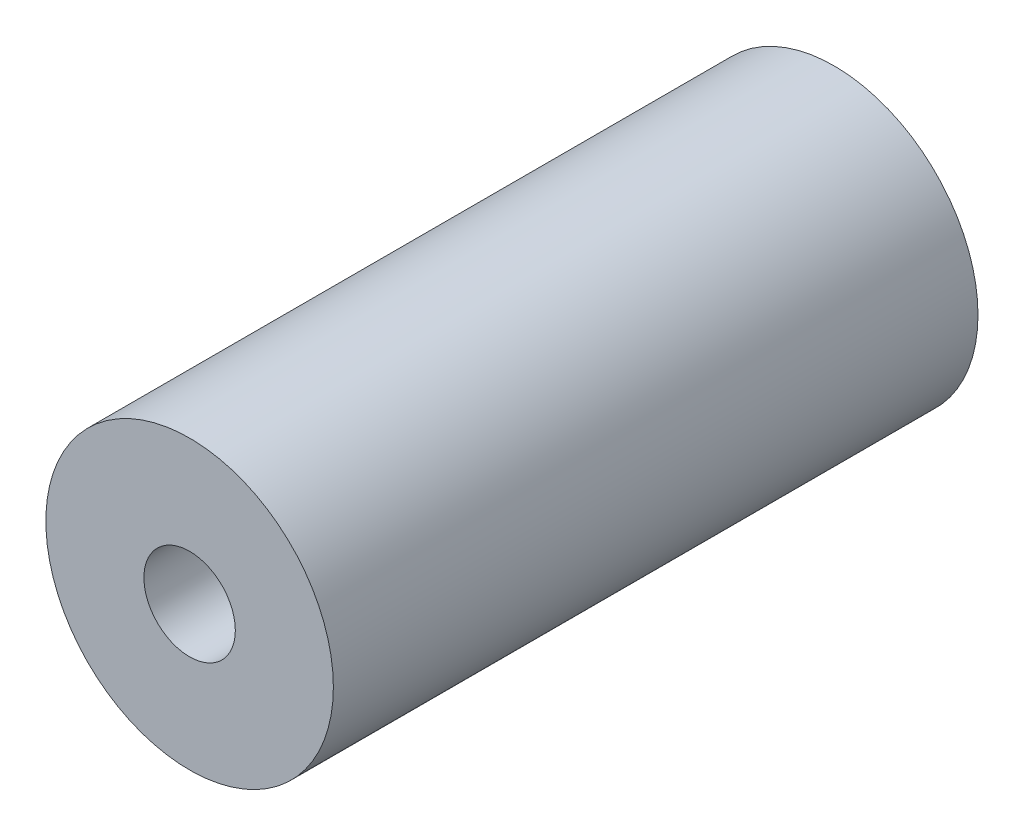
ISO-10303-21;
HEADER;
FILE_DESCRIPTION(('STEP AP214'),'2;1');
FILE_NAME('part.step','',(''),(''),'','','');
FILE_SCHEMA(('AUTOMOTIVE_DESIGN { 1 0 10303 214 1 1 1 1 }'));
ENDSEC;
DATA;
#1=APPLICATION_CONTEXT('core data for automotive mechanical design processes');
#2=APPLICATION_PROTOCOL_DEFINITION('international standard','automotive_design',2000,#1);
#3=PRODUCT_CONTEXT('',#1,'mechanical');
#4=PRODUCT('Part','Part','',(#3));
#5=PRODUCT_RELATED_PRODUCT_CATEGORY('part','',(#4));
#6=PRODUCT_DEFINITION_FORMATION('','',#4);
#7=PRODUCT_DEFINITION_CONTEXT('part definition',#1,'design');
#8=PRODUCT_DEFINITION('design','',#6,#7);
#9=PRODUCT_DEFINITION_SHAPE('','',#8);
#10=(LENGTH_UNIT() NAMED_UNIT(*) SI_UNIT(.MILLI.,.METRE.));
#11=(NAMED_UNIT(*) PLANE_ANGLE_UNIT() SI_UNIT($,.RADIAN.));
#12=(NAMED_UNIT(*) SI_UNIT($,.STERADIAN.) SOLID_ANGLE_UNIT());
#13=UNCERTAINTY_MEASURE_WITH_UNIT(LENGTH_MEASURE(1.E-05),#10,'distance_accuracy_value','');
#14=(GEOMETRIC_REPRESENTATION_CONTEXT(3) GLOBAL_UNCERTAINTY_ASSIGNED_CONTEXT((#13)) GLOBAL_UNIT_ASSIGNED_CONTEXT((#10,
#11,#12)) REPRESENTATION_CONTEXT('',''));
#15=CARTESIAN_POINT('',(0.,0.,0.));
#16=DIRECTION('',(0.,0.,1.));
#17=DIRECTION('',(1.,0.,0.));
#18=AXIS2_PLACEMENT_3D('',#15,#16,#17);
#19=CARTESIAN_POINT('',(0.,0.,28.4734));
#20=DIRECTION('',(0.,0.,-1.));
#21=DIRECTION('',(-1.,0.,0.));
#22=AXIS2_PLACEMENT_3D('',#19,#20,#21);
#23=CYLINDRICAL_SURFACE('',#22,6.35);
#24=CARTESIAN_POINT('',(0.,0.,28.4734));
#25=DIRECTION('',(0.,0.,1.));
#26=DIRECTION('',(1.,0.,0.));
#27=AXIS2_PLACEMENT_3D('',#24,#25,#26);
#28=CIRCLE('',#27,6.35);
#29=CARTESIAN_POINT('',(6.35,0.,28.4734));
#30=VERTEX_POINT('',#29);
#31=EDGE_CURVE('E11',#30,#30,#28,.T.);
#32=ORIENTED_EDGE('',*,*,#31,.F.);
#33=EDGE_LOOP('',(#32));
#34=FACE_BOUND('',#33,.T.);
#35=CARTESIAN_POINT('',(0.,0.,0.));
#36=DIRECTION('',(0.,0.,1.));
#37=DIRECTION('',(1.,0.,0.));
#38=AXIS2_PLACEMENT_3D('',#35,#36,#37);
#39=CIRCLE('',#38,6.35);
#40=CARTESIAN_POINT('',(6.35,0.,0.));
#41=VERTEX_POINT('',#40);
#42=EDGE_CURVE('E40',#41,#41,#39,.T.);
#43=ORIENTED_EDGE('',*,*,#42,.T.);
#44=EDGE_LOOP('',(#43));
#45=FACE_BOUND('',#44,.T.);
#46=ADVANCED_FACE('F37',(#34,#45),#23,.T.);
#47=CARTESIAN_POINT('',(0.,0.,28.4734));
#48=DIRECTION('',(0.,0.,1.));
#49=DIRECTION('',(1.,0.,0.));
#50=AXIS2_PLACEMENT_3D('',#47,#48,#49);
#51=PLANE('',#50);
#52=CARTESIAN_POINT('',(0.,0.,28.4734));
#53=DIRECTION('',(0.,0.,1.));
#54=DIRECTION('',(1.,0.,0.));
#55=AXIS2_PLACEMENT_3D('',#52,#53,#54);
#56=CIRCLE('',#55,2.0193);
#57=CARTESIAN_POINT('',(2.0193,0.,28.4734));
#58=VERTEX_POINT('',#57);
#59=EDGE_CURVE('E60',#58,#58,#56,.T.);
#60=ORIENTED_EDGE('',*,*,#59,.F.);
#61=EDGE_LOOP('',(#60));
#62=FACE_BOUND('',#61,.T.);
#63=ORIENTED_EDGE('',*,*,#31,.T.);
#64=EDGE_LOOP('',(#63));
#65=FACE_BOUND('',#64,.T.);
#66=ADVANCED_FACE('F79',(#62,#65),#51,.T.);
#67=CARTESIAN_POINT('',(0.,0.,0.));
#68=DIRECTION('',(0.,0.,1.));
#69=DIRECTION('',(1.,0.,0.));
#70=AXIS2_PLACEMENT_3D('',#67,#68,#69);
#71=PLANE('',#70);
#72=CARTESIAN_POINT('',(0.,0.,0.));
#73=DIRECTION('',(0.,0.,-1.));
#74=DIRECTION('',(-1.,0.,0.));
#75=AXIS2_PLACEMENT_3D('',#72,#73,#74);
#76=CIRCLE('',#75,2.0193);
#77=CARTESIAN_POINT('',(-2.0193,0.,0.));
#78=VERTEX_POINT('',#77);
#79=EDGE_CURVE('E61',#78,#78,#76,.T.);
#80=ORIENTED_EDGE('',*,*,#79,.F.);
#81=EDGE_LOOP('',(#80));
#82=FACE_BOUND('',#81,.T.);
#83=ORIENTED_EDGE('',*,*,#42,.F.);
#84=EDGE_LOOP('',(#83));
#85=FACE_BOUND('',#84,.T.);
#86=ADVANCED_FACE('F76',(#82,#85),#71,.F.);
#87=CARTESIAN_POINT('',(0.,0.,18.5674));
#88=DIRECTION('',(0.,0.,1.));
#89=DIRECTION('',(1.,0.,0.));
#90=AXIS2_PLACEMENT_3D('',#87,#88,#89);
#91=CONICAL_SURFACE('',#90,2.0193,1.02974425867665);
#92=CARTESIAN_POINT('',(0.,0.,17.3540821519976));
#93=VERTEX_POINT('',#92);
#94=VERTEX_LOOP('',#93);
#95=FACE_BOUND('',#94,.T.);
#96=CARTESIAN_POINT('',(0.,0.,18.5674));
#97=DIRECTION('',(0.,0.,1.));
#98=DIRECTION('',(1.,0.,0.));
#99=AXIS2_PLACEMENT_3D('',#96,#97,#98);
#100=CIRCLE('',#99,2.0193);
#101=CARTESIAN_POINT('',(2.0193,0.,18.5674));
#102=VERTEX_POINT('',#101);
#103=EDGE_CURVE('E64',#102,#102,#100,.T.);
#104=ORIENTED_EDGE('',*,*,#103,.T.);
#105=EDGE_LOOP('',(#104));
#106=FACE_BOUND('',#105,.T.);
#107=ADVANCED_FACE('F78',(#95,#106),#91,.F.);
#108=CARTESIAN_POINT('',(0.,0.,28.4734));
#109=DIRECTION('',(0.,0.,1.));
#110=DIRECTION('',(1.,0.,0.));
#111=AXIS2_PLACEMENT_3D('',#108,#109,#110);
#112=CYLINDRICAL_SURFACE('',#111,2.0193);
#113=ORIENTED_EDGE('',*,*,#103,.F.);
#114=EDGE_LOOP('',(#113));
#115=FACE_BOUND('',#114,.T.);
#116=ORIENTED_EDGE('',*,*,#59,.T.);
#117=EDGE_LOOP('',(#116));
#118=FACE_BOUND('',#117,.T.);
#119=ADVANCED_FACE('F54',(#115,#118),#112,.F.);
#120=CARTESIAN_POINT('',(0.,0.,11.938));
#121=DIRECTION('',(0.,0.,-1.));
#122=DIRECTION('',(-1.,0.,0.));
#123=AXIS2_PLACEMENT_3D('',#120,#121,#122);
#124=CONICAL_SURFACE('',#123,2.0193,1.02974425867665);
#125=CARTESIAN_POINT('',(0.,0.,13.1513178480024));
#126=VERTEX_POINT('',#125);
#127=VERTEX_LOOP('',#126);
#128=FACE_BOUND('',#127,.T.);
#129=CARTESIAN_POINT('',(0.,0.,11.938));
#130=DIRECTION('',(0.,0.,-1.));
#131=DIRECTION('',(-1.,0.,0.));
#132=AXIS2_PLACEMENT_3D('',#129,#130,#131);
#133=CIRCLE('',#132,2.0193);
#134=CARTESIAN_POINT('',(-2.0193,0.,11.938));
#135=VERTEX_POINT('',#134);
#136=EDGE_CURVE('E58',#135,#135,#133,.T.);
#137=ORIENTED_EDGE('',*,*,#136,.T.);
#138=EDGE_LOOP('',(#137));
#139=FACE_BOUND('',#138,.T.);
#140=ADVANCED_FACE('F50',(#128,#139),#124,.F.);
#141=CARTESIAN_POINT('',(0.,0.,0.));
#142=DIRECTION('',(0.,0.,-1.));
#143=DIRECTION('',(-1.,0.,0.));
#144=AXIS2_PLACEMENT_3D('',#141,#142,#143);
#145=CYLINDRICAL_SURFACE('',#144,2.0193);
#146=ORIENTED_EDGE('',*,*,#136,.F.);
#147=EDGE_LOOP('',(#146));
#148=FACE_BOUND('',#147,.T.);
#149=ORIENTED_EDGE('',*,*,#79,.T.);
#150=EDGE_LOOP('',(#149));
#151=FACE_BOUND('',#150,.T.);
#152=ADVANCED_FACE('F53',(#148,#151),#145,.F.);
#153=CLOSED_SHELL('',(#46,#66,#86,#107,#119,#140,#152));
#154=MANIFOLD_SOLID_BREP('B2',#153);
#155=ADVANCED_BREP_SHAPE_REPRESENTATION('',(#18,#154),#14);
#156=SHAPE_DEFINITION_REPRESENTATION(#9,#155);
ENDSEC;
END-ISO-10303-21;
